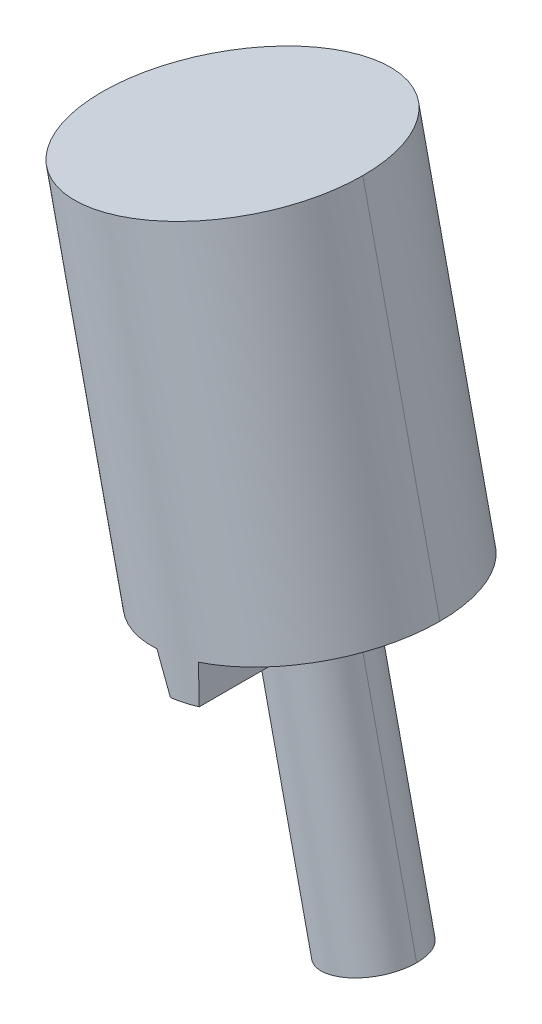
ISO-10303-21;
HEADER;
FILE_DESCRIPTION(('STEP AP214'),'2;1');
FILE_NAME('part.step','',(''),(''),'','','');
FILE_SCHEMA(('AUTOMOTIVE_DESIGN { 1 0 10303 214 1 1 1 1 }'));
ENDSEC;
DATA;
#1=APPLICATION_CONTEXT('core data for automotive mechanical design processes');
#2=APPLICATION_PROTOCOL_DEFINITION('international standard','automotive_design',2000,#1);
#3=PRODUCT_CONTEXT('',#1,'mechanical');
#4=PRODUCT('Part','Part','',(#3));
#5=PRODUCT_RELATED_PRODUCT_CATEGORY('part','',(#4));
#6=PRODUCT_DEFINITION_FORMATION('','',#4);
#7=PRODUCT_DEFINITION_CONTEXT('part definition',#1,'design');
#8=PRODUCT_DEFINITION('design','',#6,#7);
#9=PRODUCT_DEFINITION_SHAPE('','',#8);
#10=(LENGTH_UNIT() NAMED_UNIT(*) SI_UNIT(.MILLI.,.METRE.));
#11=(NAMED_UNIT(*) PLANE_ANGLE_UNIT() SI_UNIT($,.RADIAN.));
#12=(NAMED_UNIT(*) SI_UNIT($,.STERADIAN.) SOLID_ANGLE_UNIT());
#13=UNCERTAINTY_MEASURE_WITH_UNIT(LENGTH_MEASURE(1.E-05),#10,'distance_accuracy_value','');
#14=(GEOMETRIC_REPRESENTATION_CONTEXT(3) GLOBAL_UNCERTAINTY_ASSIGNED_CONTEXT((#13)) GLOBAL_UNIT_ASSIGNED_CONTEXT((#10,
#11,#12)) REPRESENTATION_CONTEXT('',''));
#15=CARTESIAN_POINT('',(0.,0.,0.));
#16=DIRECTION('',(0.,0.,1.));
#17=DIRECTION('',(1.,0.,0.));
#18=AXIS2_PLACEMENT_3D('',#15,#16,#17);
#19=CARTESIAN_POINT('',(0.019547140488139,-3.8981714528221,0.));
#20=DIRECTION('',(-0.216439613938103,0.976296007119933,0.));
#21=DIRECTION('',(0.,0.,-1.));
#22=AXIS2_PLACEMENT_3D('',#19,#20,#21);
#23=CYLINDRICAL_SURFACE('',#22,0.76200000000001);
#24=CARTESIAN_POINT('',(0.0195471404881461,-3.89817145282212,0.));
#25=DIRECTION('',(0.216439613938103,-0.976296007119933,0.));
#26=DIRECTION('',(0.976296007119933,0.216439613938103,0.));
#27=AXIS2_PLACEMENT_3D('',#24,#25,#26);
#28=CIRCLE('',#27,0.761999999999995);
#29=CARTESIAN_POINT('',(0.763484697913529,-3.73324446700129,0.));
#30=VERTEX_POINT('',#29);
#31=CARTESIAN_POINT('',(-0.724390416937254,-4.06309843864296,0.));
#32=VERTEX_POINT('',#31);
#33=EDGE_CURVE('E11',#30,#32,#28,.T.);
#34=ORIENTED_EDGE('',*,*,#33,.F.);
#35=CARTESIAN_POINT('',(0.763484697913544,-3.73324446700129,0.));
#36=DIRECTION('',(-0.216439613938103,0.976296007119933,0.));
#37=VECTOR('',#36,1.);
#38=LINE('',#35,#37);
#39=CARTESIAN_POINT('',(-0.336028540892025,1.226339249168,0.));
#40=VERTEX_POINT('',#39);
#41=EDGE_CURVE('E25',#30,#40,#38,.T.);
#42=ORIENTED_EDGE('',*,*,#41,.T.);
#43=CARTESIAN_POINT('',(-1.07996609831743,1.06141226334718,0.));
#44=DIRECTION('',(0.216439613938076,-0.976296007119939,0.));
#45=DIRECTION('',(0.976296007119939,0.216439613938076,0.));
#46=AXIS2_PLACEMENT_3D('',#43,#44,#45);
#47=CIRCLE('',#46,0.76200000000001);
#48=CARTESIAN_POINT('',(-0.722673359728581,1.1406221564934,0.66836493907106));
#49=VERTEX_POINT('',#48);
#50=EDGE_CURVE('E311',#40,#49,#47,.T.);
#51=ORIENTED_EDGE('',*,*,#50,.T.);
#52=CARTESIAN_POINT('',(-0.630744471383383,-0.964895549293119,0.));
#53=DIRECTION('',(0.999048221581858,0.0436193873653314,0.));
#54=DIRECTION('',(0.0436193873653314,-0.999048221581858,0.));
#55=AXIS2_PLACEMENT_3D('',#52,#53,#54);
#56=ELLIPSE('',#55,4.3881831081554,0.76200000000001);
#57=CARTESIAN_POINT('',(-0.69454775765826,0.496439960766249,0.718420489685542));
#58=VERTEX_POINT('',#57);
#59=EDGE_CURVE('E307',#49,#58,#56,.T.);
#60=ORIENTED_EDGE('',*,*,#59,.T.);
#61=CARTESIAN_POINT('',(-0.942526943466722,0.441464298825971,0.));
#62=DIRECTION('',(0.216439613938104,-0.976296007119933,0.));
#63=DIRECTION('',(0.976296007119933,0.216439613938104,0.));
#64=AXIS2_PLACEMENT_3D('',#61,#62,#63);
#65=CIRCLE('',#64,0.76200000000001);
#66=CARTESIAN_POINT('',(-1.1905061292752,0.386488636885689,0.718420489685537));
#67=VERTEX_POINT('',#66);
#68=EDGE_CURVE('E303',#58,#67,#65,.T.);
#69=ORIENTED_EDGE('',*,*,#68,.T.);
#70=CARTESIAN_POINT('',(-0.630744471383424,-0.964895549292941,0.));
#71=DIRECTION('',(-0.923879532511272,-0.382683432365125,0.));
#72=DIRECTION('',(0.382683432365125,-0.923879532511272,0.));
#73=AXIS2_PLACEMENT_3D('',#70,#71,#72);
#74=ELLIPSE('',#73,4.38818310815456,0.76200000000001);
#75=CARTESIAN_POINT('',(-1.4372588369063,0.982202370200909,0.66836493907104));
#76=VERTEX_POINT('',#75);
#77=EDGE_CURVE('E299',#67,#76,#74,.T.);
#78=ORIENTED_EDGE('',*,*,#77,.T.);
#79=CARTESIAN_POINT('',(-1.07996609831742,1.06141226334715,0.));
#80=DIRECTION('',(0.216439613938108,-0.976296007119932,0.));
#81=DIRECTION('',(0.976296007119932,0.216439613938108,0.));
#82=AXIS2_PLACEMENT_3D('',#79,#80,#81);
#83=CIRCLE('',#82,0.76200000000001);
#84=CARTESIAN_POINT('',(-1.82390365574282,0.896485277526306,0.));
#85=VERTEX_POINT('',#84);
#86=EDGE_CURVE('E297',#76,#85,#83,.T.);
#87=ORIENTED_EDGE('',*,*,#86,.T.);
#88=CARTESIAN_POINT('',(-0.724390416937254,-4.06309843864296,0.));
#89=DIRECTION('',(-0.216439613938103,0.976296007119933,0.));
#90=VECTOR('',#89,1.);
#91=LINE('',#88,#90);
#92=EDGE_CURVE('E285',#32,#85,#91,.T.);
#93=ORIENTED_EDGE('',*,*,#92,.F.);
#94=EDGE_LOOP('',(#34,#42,#51,#60,#69,#78,#87,#93));
#95=FACE_BOUND('',#94,.T.);
#96=ADVANCED_FACE('F16',(#95),#23,.T.);
#97=CARTESIAN_POINT('',(0.019547140488139,-3.8981714528221,0.));
#98=DIRECTION('',(-0.216439613938103,0.976296007119933,0.));
#99=DIRECTION('',(0.,0.,1.));
#100=AXIS2_PLACEMENT_3D('',#97,#98,#99);
#101=CYLINDRICAL_SURFACE('',#100,0.76200000000001);
#102=CARTESIAN_POINT('',(-1.07996609831742,1.06141226334715,0.));
#103=DIRECTION('',(0.216439613938108,-0.976296007119932,0.));
#104=DIRECTION('',(0.976296007119932,0.216439613938108,0.));
#105=AXIS2_PLACEMENT_3D('',#102,#103,#104);
#106=CIRCLE('',#105,0.76200000000001);
#107=CARTESIAN_POINT('',(-1.4372588369063,0.982202370200909,-0.66836493907104));
#108=VERTEX_POINT('',#107);
#109=EDGE_CURVE('E281',#85,#108,#106,.T.);
#110=ORIENTED_EDGE('',*,*,#109,.T.);
#111=CARTESIAN_POINT('',(-0.630744471383424,-0.964895549292941,0.));
#112=DIRECTION('',(-0.923879532511272,-0.382683432365125,0.));
#113=DIRECTION('',(0.382683432365125,-0.923879532511272,0.));
#114=AXIS2_PLACEMENT_3D('',#111,#112,#113);
#115=ELLIPSE('',#114,4.38818310815456,0.76200000000001);
#116=CARTESIAN_POINT('',(-1.1905061292752,0.386488636885689,-0.718420489685537));
#117=VERTEX_POINT('',#116);
#118=EDGE_CURVE('E126',#108,#117,#115,.T.);
#119=ORIENTED_EDGE('',*,*,#118,.T.);
#120=CARTESIAN_POINT('',(-0.942526943466722,0.441464298825971,0.));
#121=DIRECTION('',(0.216439613938104,-0.976296007119933,0.));
#122=DIRECTION('',(0.976296007119933,0.216439613938104,0.));
#123=AXIS2_PLACEMENT_3D('',#120,#121,#122);
#124=CIRCLE('',#123,0.76200000000001);
#125=CARTESIAN_POINT('',(-0.69454775765826,0.496439960766249,-0.718420489685542));
#126=VERTEX_POINT('',#125);
#127=EDGE_CURVE('E274',#117,#126,#124,.T.);
#128=ORIENTED_EDGE('',*,*,#127,.T.);
#129=CARTESIAN_POINT('',(-0.630744471383383,-0.964895549293119,0.));
#130=DIRECTION('',(0.999048221581858,0.0436193873653314,0.));
#131=DIRECTION('',(0.0436193873653314,-0.999048221581858,0.));
#132=AXIS2_PLACEMENT_3D('',#129,#130,#131);
#133=ELLIPSE('',#132,4.3881831081554,0.76200000000001);
#134=CARTESIAN_POINT('',(-0.722673359728579,1.1406221564934,-0.66836493907106));
#135=VERTEX_POINT('',#134);
#136=EDGE_CURVE('E270',#126,#135,#133,.T.);
#137=ORIENTED_EDGE('',*,*,#136,.T.);
#138=CARTESIAN_POINT('',(-1.07996609831743,1.06141226334718,0.));
#139=DIRECTION('',(0.216439613938076,-0.976296007119939,0.));
#140=DIRECTION('',(0.976296007119939,0.216439613938076,0.));
#141=AXIS2_PLACEMENT_3D('',#138,#139,#140);
#142=CIRCLE('',#141,0.76200000000001);
#143=EDGE_CURVE('E268',#135,#40,#142,.T.);
#144=ORIENTED_EDGE('',*,*,#143,.T.);
#145=ORIENTED_EDGE('',*,*,#41,.F.);
#146=CARTESIAN_POINT('',(0.0195471404881461,-3.89817145282212,0.));
#147=DIRECTION('',(0.216439613938103,-0.976296007119933,0.));
#148=DIRECTION('',(0.976296007119933,0.216439613938103,0.));
#149=AXIS2_PLACEMENT_3D('',#146,#147,#148);
#150=CIRCLE('',#149,0.761999999999995);
#151=EDGE_CURVE('E234',#32,#30,#150,.T.);
#152=ORIENTED_EDGE('',*,*,#151,.F.);
#153=ORIENTED_EDGE('',*,*,#92,.T.);
#154=EDGE_LOOP('',(#110,#119,#128,#137,#144,#145,#152,#153));
#155=FACE_BOUND('',#154,.T.);
#156=ADVANCED_FACE('F242',(#155),#101,.T.);
#157=CARTESIAN_POINT('',(0.763484697913527,-3.73324446700129,0.));
#158=DIRECTION('',(-0.216439613938103,0.976296007119933,0.));
#159=DIRECTION('',(-0.976296007119933,-0.216439613938103,0.));
#160=AXIS2_PLACEMENT_3D('',#157,#158,#159);
#161=PLANE('',#160);
#162=ORIENTED_EDGE('',*,*,#33,.T.);
#163=ORIENTED_EDGE('',*,*,#151,.T.);
#164=EDGE_LOOP('',(#162,#163));
#165=FACE_BOUND('',#164,.T.);
#166=ADVANCED_FACE('F251',(#165),#161,.F.);
#167=CARTESIAN_POINT('',(1.4122247190576,1.6139176658469,2.2987));
#168=DIRECTION('',(0.216439613938075,-0.97629600711994,0.));
#169=DIRECTION('',(0.97629600711994,0.216439613938075,0.));
#170=AXIS2_PLACEMENT_3D('',#167,#168,#169);
#171=PLANE('',#170);
#172=DIRECTION('',(0.,0.,-1.));
#173=VECTOR('',#172,1.);
#174=CARTESIAN_POINT('',(-0.722673359728581,1.1406221564934,2.2987));
#175=LINE('',#174,#173);
#176=CARTESIAN_POINT('',(-0.722673359728581,1.1406221564934,2.26938083665557));
#177=VERTEX_POINT('',#176);
#178=EDGE_CURVE('E229',#177,#49,#175,.T.);
#179=ORIENTED_EDGE('',*,*,#178,.T.);
#180=ORIENTED_EDGE('',*,*,#50,.F.);
#181=ORIENTED_EDGE('',*,*,#143,.F.);
#182=DIRECTION('',(0.,0.,-1.));
#183=VECTOR('',#182,1.);
#184=CARTESIAN_POINT('',(-0.722673359728581,1.1406221564934,2.2987));
#185=LINE('',#184,#183);
#186=CARTESIAN_POINT('',(-0.722673359728581,1.1406221564934,-2.26938083665557));
#187=VERTEX_POINT('',#186);
#188=EDGE_CURVE('E225',#135,#187,#185,.T.);
#189=ORIENTED_EDGE('',*,*,#188,.T.);
#190=CARTESIAN_POINT('',(-1.07996609831743,1.06141226334718,0.));
#191=DIRECTION('',(0.216439613938076,-0.976296007119939,0.));
#192=DIRECTION('',(0.976296007119939,0.216439613938076,0.));
#193=AXIS2_PLACEMENT_3D('',#190,#191,#192);
#194=CIRCLE('',#193,2.29870000000002);
#195=CARTESIAN_POINT('',(1.16424553324919,1.55894200390664,0.));
#196=VERTEX_POINT('',#195);
#197=EDGE_CURVE('E221',#187,#196,#194,.T.);
#198=ORIENTED_EDGE('',*,*,#197,.T.);
#199=CARTESIAN_POINT('',(-1.07996609831743,1.06141226334718,0.));
#200=DIRECTION('',(0.216439613938076,-0.976296007119939,0.));
#201=DIRECTION('',(0.976296007119939,0.216439613938076,0.));
#202=AXIS2_PLACEMENT_3D('',#199,#200,#201);
#203=CIRCLE('',#202,2.29870000000002);
#204=EDGE_CURVE('E217',#196,#177,#203,.T.);
#205=ORIENTED_EDGE('',*,*,#204,.T.);
#206=EDGE_LOOP('',(#179,#180,#181,#189,#198,#205));
#207=FACE_BOUND('',#206,.T.);
#208=ADVANCED_FACE('F330',(#207),#171,.T.);
#209=CARTESIAN_POINT('',(-0.805087788616031,-0.17848366569519,0.));
#210=DIRECTION('',(-0.216439613938103,0.976296007119933,0.));
#211=DIRECTION('',(0.,0.,-1.));
#212=AXIS2_PLACEMENT_3D('',#209,#210,#211);
#213=CYLINDRICAL_SURFACE('',#212,2.29870000000002);
#214=CARTESIAN_POINT('',(-1.07996609831743,1.06141226334715,0.));
#215=DIRECTION('',(0.216439613938108,-0.976296007119932,0.));
#216=DIRECTION('',(0.976296007119932,0.216439613938108,0.));
#217=AXIS2_PLACEMENT_3D('',#214,#215,#216);
#218=CIRCLE('',#217,2.29870000000002);
#219=CARTESIAN_POINT('',(-1.4372588369063,0.982202370200909,2.26938083665556));
#220=VERTEX_POINT('',#219);
#221=CARTESIAN_POINT('',(-3.32417772988403,0.563882522787613,0.));
#222=VERTEX_POINT('',#221);
#223=EDGE_CURVE('E123',#220,#222,#218,.T.);
#224=ORIENTED_EDGE('',*,*,#223,.F.);
#225=CARTESIAN_POINT('',(-0.630744471383434,-0.964895549292913,0.));
#226=DIRECTION('',(-0.923879532511272,-0.382683432365125,0.));
#227=DIRECTION('',(0.382683432365125,-0.923879532511272,0.));
#228=AXIS2_PLACEMENT_3D('',#225,#226,#227);
#229=ELLIPSE('',#228,13.2376857095995,2.29870000000002);
#230=CARTESIAN_POINT('',(-1.1905061292752,0.386488636885689,2.28462375239339));
#231=VERTEX_POINT('',#230);
#232=EDGE_CURVE('E209',#231,#220,#229,.T.);
#233=ORIENTED_EDGE('',*,*,#232,.F.);
#234=CARTESIAN_POINT('',(-0.942526943466727,0.441464298825971,0.));
#235=DIRECTION('',(0.216439613938104,-0.976296007119933,0.));
#236=DIRECTION('',(0.976296007119933,0.216439613938104,0.));
#237=AXIS2_PLACEMENT_3D('',#234,#235,#236);
#238=CIRCLE('',#237,2.29870000000002);
#239=CARTESIAN_POINT('',(-0.69454775765826,0.496439960766251,2.28462375239339));
#240=VERTEX_POINT('',#239);
#241=EDGE_CURVE('E204',#240,#231,#238,.T.);
#242=ORIENTED_EDGE('',*,*,#241,.F.);
#243=CARTESIAN_POINT('',(-0.630744471383383,-0.964895549293147,0.));
#244=DIRECTION('',(0.999048221581858,0.0436193873653314,0.));
#245=DIRECTION('',(0.0436193873653314,-0.999048221581858,0.));
#246=AXIS2_PLACEMENT_3D('',#243,#244,#245);
#247=ELLIPSE('',#246,13.237685709602,2.29870000000002);
#248=EDGE_CURVE('E201',#177,#240,#247,.T.);
#249=ORIENTED_EDGE('',*,*,#248,.F.);
#250=ORIENTED_EDGE('',*,*,#204,.F.);
#251=CARTESIAN_POINT('',(1.16424553324919,1.55894200390664,0.));
#252=DIRECTION('',(-0.216439613938103,0.976296007119933,0.));
#253=VECTOR('',#252,1.);
#254=LINE('',#251,#253);
#255=CARTESIAN_POINT('',(-0.16211908375491,7.54178616078341,0.));
#256=VERTEX_POINT('',#255);
#257=EDGE_CURVE('E170',#196,#256,#254,.T.);
#258=ORIENTED_EDGE('',*,*,#257,.T.);
#259=CARTESIAN_POINT('',(-2.4063307153215,7.04425642022388,0.));
#260=DIRECTION('',(0.216439613938103,-0.976296007119933,0.));
#261=DIRECTION('',(0.976296007119933,0.216439613938103,0.));
#262=AXIS2_PLACEMENT_3D('',#259,#260,#261);
#263=CIRCLE('',#262,2.29869999999999);
#264=CARTESIAN_POINT('',(-4.65054234688811,6.54672667966436,0.));
#265=VERTEX_POINT('',#264);
#266=EDGE_CURVE('E187',#256,#265,#263,.T.);
#267=ORIENTED_EDGE('',*,*,#266,.T.);
#268=CARTESIAN_POINT('',(-3.32417772988403,0.563882522787613,0.));
#269=DIRECTION('',(-0.216439613938103,0.976296007119933,0.));
#270=VECTOR('',#269,1.);
#271=LINE('',#268,#270);
#272=EDGE_CURVE('E173',#222,#265,#271,.T.);
#273=ORIENTED_EDGE('',*,*,#272,.F.);
#274=EDGE_LOOP('',(#224,#233,#242,#249,#250,#258,#267,#273));
#275=FACE_BOUND('',#274,.T.);
#276=ADVANCED_FACE('F150',(#275),#213,.T.);
#277=CARTESIAN_POINT('',(-0.805087788616031,-0.17848366569519,0.));
#278=DIRECTION('',(-0.216439613938103,0.976296007119933,0.));
#279=DIRECTION('',(0.,0.,1.));
#280=AXIS2_PLACEMENT_3D('',#277,#278,#279);
#281=CYLINDRICAL_SURFACE('',#280,2.29870000000002);
#282=CARTESIAN_POINT('',(-2.4063307153215,7.04425642022388,0.));
#283=DIRECTION('',(0.216439613938103,-0.976296007119933,0.));
#284=DIRECTION('',(0.976296007119933,0.216439613938103,0.));
#285=AXIS2_PLACEMENT_3D('',#282,#283,#284);
#286=CIRCLE('',#285,2.29869999999999);
#287=EDGE_CURVE('E171',#265,#256,#286,.T.);
#288=ORIENTED_EDGE('',*,*,#287,.T.);
#289=ORIENTED_EDGE('',*,*,#257,.F.);
#290=ORIENTED_EDGE('',*,*,#197,.F.);
#291=CARTESIAN_POINT('',(-0.630744471383383,-0.964895549293147,0.));
#292=DIRECTION('',(0.999048221581858,0.0436193873653314,0.));
#293=DIRECTION('',(0.0436193873653314,-0.999048221581858,0.));
#294=AXIS2_PLACEMENT_3D('',#291,#292,#293);
#295=ELLIPSE('',#294,13.237685709602,2.29870000000002);
#296=CARTESIAN_POINT('',(-0.69454775765826,0.496439960766251,-2.28462375239339));
#297=VERTEX_POINT('',#296);
#298=EDGE_CURVE('E174',#297,#187,#295,.T.);
#299=ORIENTED_EDGE('',*,*,#298,.F.);
#300=CARTESIAN_POINT('',(-0.942526943466727,0.441464298825971,0.));
#301=DIRECTION('',(0.216439613938104,-0.976296007119933,0.));
#302=DIRECTION('',(0.976296007119933,0.216439613938104,0.));
#303=AXIS2_PLACEMENT_3D('',#300,#301,#302);
#304=CIRCLE('',#303,2.29870000000002);
#305=CARTESIAN_POINT('',(-1.1905061292752,0.386488636885689,-2.28462375239339));
#306=VERTEX_POINT('',#305);
#307=EDGE_CURVE('E110',#306,#297,#304,.T.);
#308=ORIENTED_EDGE('',*,*,#307,.F.);
#309=CARTESIAN_POINT('',(-0.630744471383434,-0.964895549292913,0.));
#310=DIRECTION('',(-0.923879532511272,-0.382683432365125,0.));
#311=DIRECTION('',(0.382683432365125,-0.923879532511272,0.));
#312=AXIS2_PLACEMENT_3D('',#309,#310,#311);
#313=ELLIPSE('',#312,13.2376857095995,2.29870000000002);
#314=CARTESIAN_POINT('',(-1.4372588369063,0.982202370200909,-2.26938083665556));
#315=VERTEX_POINT('',#314);
#316=EDGE_CURVE('E102',#315,#306,#313,.T.);
#317=ORIENTED_EDGE('',*,*,#316,.F.);
#318=CARTESIAN_POINT('',(-1.07996609831743,1.06141226334715,0.));
#319=DIRECTION('',(0.216439613938108,-0.976296007119932,0.));
#320=DIRECTION('',(0.976296007119932,0.216439613938108,0.));
#321=AXIS2_PLACEMENT_3D('',#318,#319,#320);
#322=CIRCLE('',#321,2.29870000000002);
#323=EDGE_CURVE('E107',#222,#315,#322,.T.);
#324=ORIENTED_EDGE('',*,*,#323,.F.);
#325=ORIENTED_EDGE('',*,*,#272,.T.);
#326=EDGE_LOOP('',(#288,#289,#290,#299,#308,#317,#324,#325));
#327=FACE_BOUND('',#326,.T.);
#328=ADVANCED_FACE('F105',(#327),#281,.T.);
#329=CARTESIAN_POINT('',(-1.4372588369063,0.982202370200909,2.2987));
#330=DIRECTION('',(0.216439613938108,-0.976296007119932,0.));
#331=DIRECTION('',(0.976296007119932,0.216439613938108,0.));
#332=AXIS2_PLACEMENT_3D('',#329,#330,#331);
#333=PLANE('',#332);
#334=DIRECTION('',(0.,0.,-1.));
#335=VECTOR('',#334,1.);
#336=CARTESIAN_POINT('',(-1.4372588369063,0.982202370200909,2.2987));
#337=LINE('',#336,#335);
#338=EDGE_CURVE('E120',#108,#315,#337,.T.);
#339=ORIENTED_EDGE('',*,*,#338,.F.);
#340=ORIENTED_EDGE('',*,*,#109,.F.);
#341=ORIENTED_EDGE('',*,*,#86,.F.);
#342=DIRECTION('',(0.,0.,-1.));
#343=VECTOR('',#342,1.);
#344=CARTESIAN_POINT('',(-1.4372588369063,0.982202370200909,2.2987));
#345=LINE('',#344,#343);
#346=EDGE_CURVE('E127',#220,#76,#345,.T.);
#347=ORIENTED_EDGE('',*,*,#346,.F.);
#348=ORIENTED_EDGE('',*,*,#223,.T.);
#349=ORIENTED_EDGE('',*,*,#323,.T.);
#350=EDGE_LOOP('',(#339,#340,#341,#347,#348,#349));
#351=FACE_BOUND('',#350,.T.);
#352=ADVANCED_FACE('F118',(#351),#333,.T.);
#353=CARTESIAN_POINT('',(-1.1905061292752,0.386488636885689,2.2987));
#354=DIRECTION('',(-0.923879532511272,-0.382683432365125,0.));
#355=DIRECTION('',(0.382683432365125,-0.923879532511272,0.));
#356=AXIS2_PLACEMENT_3D('',#353,#354,#355);
#357=PLANE('',#356);
#358=ORIENTED_EDGE('',*,*,#346,.T.);
#359=ORIENTED_EDGE('',*,*,#77,.F.);
#360=DIRECTION('',(0.,0.,-1.));
#361=VECTOR('',#360,1.);
#362=CARTESIAN_POINT('',(-1.1905061292752,0.386488636885689,2.2987));
#363=LINE('',#362,#361);
#364=EDGE_CURVE('E130',#231,#67,#363,.T.);
#365=ORIENTED_EDGE('',*,*,#364,.F.);
#366=ORIENTED_EDGE('',*,*,#232,.T.);
#367=EDGE_LOOP('',(#358,#359,#365,#366));
#368=FACE_BOUND('',#367,.T.);
#369=ADVANCED_FACE('F373',(#368),#357,.T.);
#370=CARTESIAN_POINT('',(-0.69454775765826,0.496439960766251,2.2987));
#371=DIRECTION('',(0.216439613938104,-0.976296007119933,0.));
#372=DIRECTION('',(0.976296007119933,0.216439613938104,0.));
#373=AXIS2_PLACEMENT_3D('',#370,#371,#372);
#374=PLANE('',#373);
#375=ORIENTED_EDGE('',*,*,#364,.T.);
#376=ORIENTED_EDGE('',*,*,#68,.F.);
#377=DIRECTION('',(0.,0.,-1.));
#378=VECTOR('',#377,1.);
#379=CARTESIAN_POINT('',(-0.69454775765826,0.496439960766251,2.2987));
#380=LINE('',#379,#378);
#381=EDGE_CURVE('E336',#240,#58,#380,.T.);
#382=ORIENTED_EDGE('',*,*,#381,.F.);
#383=ORIENTED_EDGE('',*,*,#241,.T.);
#384=EDGE_LOOP('',(#375,#376,#382,#383));
#385=FACE_BOUND('',#384,.T.);
#386=ADVANCED_FACE('F375',(#385),#374,.T.);
#387=CARTESIAN_POINT('',(-0.722673359728581,1.1406221564934,2.2987));
#388=DIRECTION('',(0.999048221581858,0.0436193873653314,0.));
#389=DIRECTION('',(-0.0436193873653314,0.999048221581858,0.));
#390=AXIS2_PLACEMENT_3D('',#387,#388,#389);
#391=PLANE('',#390);
#392=ORIENTED_EDGE('',*,*,#381,.T.);
#393=ORIENTED_EDGE('',*,*,#59,.F.);
#394=ORIENTED_EDGE('',*,*,#178,.F.);
#395=ORIENTED_EDGE('',*,*,#248,.T.);
#396=EDGE_LOOP('',(#392,#393,#394,#395));
#397=FACE_BOUND('',#396,.T.);
#398=ADVANCED_FACE('F334',(#397),#391,.T.);
#399=CARTESIAN_POINT('',(-1.1905061292752,0.386488636885689,2.2987));
#400=DIRECTION('',(-0.923879532511272,-0.382683432365125,0.));
#401=DIRECTION('',(0.382683432365125,-0.923879532511272,0.));
#402=AXIS2_PLACEMENT_3D('',#399,#400,#401);
#403=PLANE('',#402);
#404=DIRECTION('',(0.,0.,-1.));
#405=VECTOR('',#404,1.);
#406=CARTESIAN_POINT('',(-1.1905061292752,0.386488636885689,2.2987));
#407=LINE('',#406,#405);
#408=EDGE_CURVE('E338',#117,#306,#407,.T.);
#409=ORIENTED_EDGE('',*,*,#408,.F.);
#410=ORIENTED_EDGE('',*,*,#118,.F.);
#411=ORIENTED_EDGE('',*,*,#338,.T.);
#412=ORIENTED_EDGE('',*,*,#316,.T.);
#413=EDGE_LOOP('',(#409,#410,#411,#412));
#414=FACE_BOUND('',#413,.T.);
#415=ADVANCED_FACE('F125',(#414),#403,.T.);
#416=CARTESIAN_POINT('',(-0.69454775765826,0.496439960766251,2.2987));
#417=DIRECTION('',(0.216439613938104,-0.976296007119933,0.));
#418=DIRECTION('',(0.976296007119933,0.216439613938104,0.));
#419=AXIS2_PLACEMENT_3D('',#416,#417,#418);
#420=PLANE('',#419);
#421=DIRECTION('',(0.,0.,-1.));
#422=VECTOR('',#421,1.);
#423=CARTESIAN_POINT('',(-0.69454775765826,0.496439960766251,2.2987));
#424=LINE('',#423,#422);
#425=EDGE_CURVE('E342',#126,#297,#424,.T.);
#426=ORIENTED_EDGE('',*,*,#425,.F.);
#427=ORIENTED_EDGE('',*,*,#127,.F.);
#428=ORIENTED_EDGE('',*,*,#408,.T.);
#429=ORIENTED_EDGE('',*,*,#307,.T.);
#430=EDGE_LOOP('',(#426,#427,#428,#429));
#431=FACE_BOUND('',#430,.T.);
#432=ADVANCED_FACE('F362',(#431),#420,.T.);
#433=CARTESIAN_POINT('',(-0.722673359728581,1.1406221564934,2.2987));
#434=DIRECTION('',(0.999048221581858,0.0436193873653314,0.));
#435=DIRECTION('',(-0.0436193873653314,0.999048221581858,0.));
#436=AXIS2_PLACEMENT_3D('',#433,#434,#435);
#437=PLANE('',#436);
#438=ORIENTED_EDGE('',*,*,#188,.F.);
#439=ORIENTED_EDGE('',*,*,#136,.F.);
#440=ORIENTED_EDGE('',*,*,#425,.T.);
#441=ORIENTED_EDGE('',*,*,#298,.T.);
#442=EDGE_LOOP('',(#438,#439,#440,#441));
#443=FACE_BOUND('',#442,.T.);
#444=ADVANCED_FACE('F359',(#443),#437,.T.);
#445=CARTESIAN_POINT('',(-2.4063307153215,7.04425642022391,0.));
#446=DIRECTION('',(0.216439613938103,-0.976296007119933,0.));
#447=DIRECTION('',(0.976296007119933,0.216439613938103,0.));
#448=AXIS2_PLACEMENT_3D('',#445,#446,#447);
#449=PLANE('',#448);
#450=ORIENTED_EDGE('',*,*,#266,.F.);
#451=ORIENTED_EDGE('',*,*,#287,.F.);
#452=EDGE_LOOP('',(#450,#451));
#453=FACE_BOUND('',#452,.T.);
#454=ADVANCED_FACE('F460',(#453),#449,.F.);
#455=CLOSED_SHELL('',(#96,#156,#166,#208,#276,#328,#352,#369,#386,#398,#415,#432,#444,#454));
#456=MANIFOLD_SOLID_BREP('B1',#455);
#457=ADVANCED_BREP_SHAPE_REPRESENTATION('',(#18,#456),#14);
#458=SHAPE_DEFINITION_REPRESENTATION(#9,#457);
ENDSEC;
END-ISO-10303-21;
